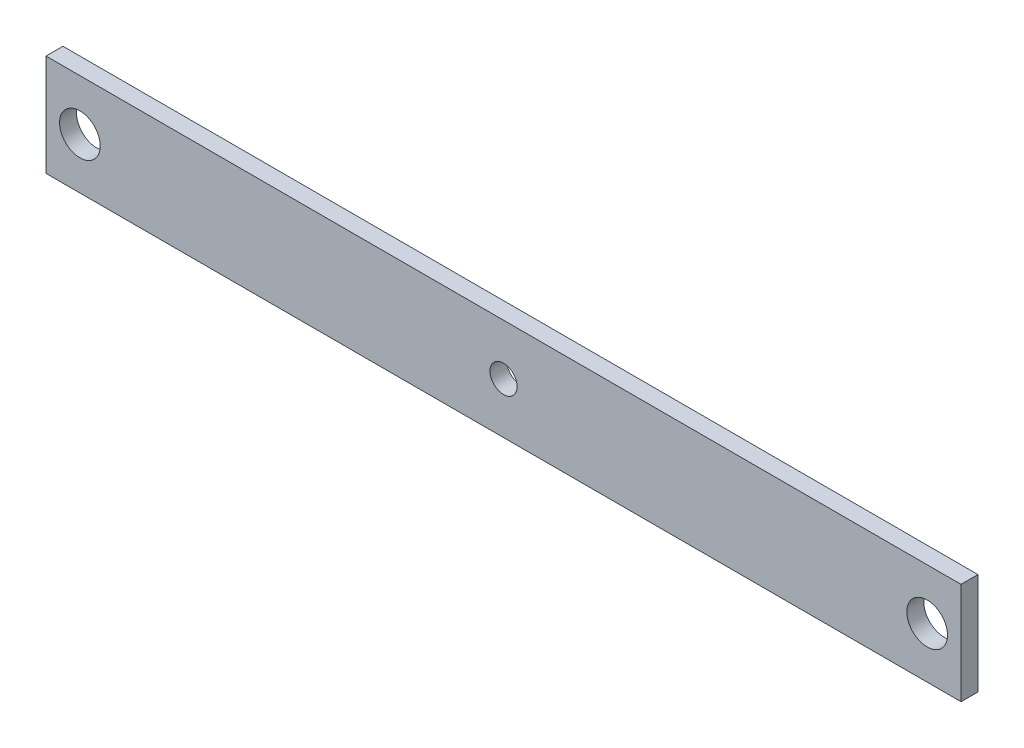
ISO-10303-21;
HEADER;
FILE_DESCRIPTION(('STEP AP214'),'2;1');
FILE_NAME('part.step','',(''),(''),'','','');
FILE_SCHEMA(('AUTOMOTIVE_DESIGN { 1 0 10303 214 1 1 1 1 }'));
ENDSEC;
DATA;
#1=APPLICATION_CONTEXT('core data for automotive mechanical design processes');
#2=APPLICATION_PROTOCOL_DEFINITION('international standard','automotive_design',2000,#1);
#3=PRODUCT_CONTEXT('',#1,'mechanical');
#4=PRODUCT('Part','Part','',(#3));
#5=PRODUCT_RELATED_PRODUCT_CATEGORY('part','',(#4));
#6=PRODUCT_DEFINITION_FORMATION('','',#4);
#7=PRODUCT_DEFINITION_CONTEXT('part definition',#1,'design');
#8=PRODUCT_DEFINITION('design','',#6,#7);
#9=PRODUCT_DEFINITION_SHAPE('','',#8);
#10=(LENGTH_UNIT() NAMED_UNIT(*) SI_UNIT(.MILLI.,.METRE.));
#11=(NAMED_UNIT(*) PLANE_ANGLE_UNIT() SI_UNIT($,.RADIAN.));
#12=(NAMED_UNIT(*) SI_UNIT($,.STERADIAN.) SOLID_ANGLE_UNIT());
#13=UNCERTAINTY_MEASURE_WITH_UNIT(LENGTH_MEASURE(1.E-05),#10,'distance_accuracy_value','');
#14=(GEOMETRIC_REPRESENTATION_CONTEXT(3) GLOBAL_UNCERTAINTY_ASSIGNED_CONTEXT((#13)) GLOBAL_UNIT_ASSIGNED_CONTEXT((#10,
#11,#12)) REPRESENTATION_CONTEXT('',''));
#15=CARTESIAN_POINT('',(0.,0.,0.));
#16=DIRECTION('',(0.,0.,1.));
#17=DIRECTION('',(1.,0.,0.));
#18=AXIS2_PLACEMENT_3D('',#15,#16,#17);
#19=CARTESIAN_POINT('',(0.,0.,5.));
#20=DIRECTION('',(0.,0.,1.));
#21=DIRECTION('',(1.,0.,0.));
#22=AXIS2_PLACEMENT_3D('',#19,#20,#21);
#23=PLANE('',#22);
#24=CARTESIAN_POINT('',(125.,0.,5.));
#25=DIRECTION('',(0.,0.,1.));
#26=DIRECTION('',(1.,0.,0.));
#27=AXIS2_PLACEMENT_3D('',#24,#25,#26);
#28=CIRCLE('',#27,6.00000000000002);
#29=CARTESIAN_POINT('',(131.,0.,5.));
#30=VERTEX_POINT('',#29);
#31=EDGE_CURVE('E117',#30,#30,#28,.T.);
#32=ORIENTED_EDGE('',*,*,#31,.F.);
#33=EDGE_LOOP('',(#32));
#34=FACE_BOUND('',#33,.T.);
#35=DIRECTION('',(0.,1.,0.));
#36=VECTOR('',#35,1.);
#37=CARTESIAN_POINT('',(135.,15.,5.));
#38=LINE('',#37,#36);
#39=CARTESIAN_POINT('',(135.,-15.,5.));
#40=VERTEX_POINT('',#39);
#41=CARTESIAN_POINT('',(135.,15.,5.));
#42=VERTEX_POINT('',#41);
#43=EDGE_CURVE('E87',#40,#42,#38,.T.);
#44=ORIENTED_EDGE('',*,*,#43,.T.);
#45=DIRECTION('',(-1.,0.,0.));
#46=VECTOR('',#45,1.);
#47=CARTESIAN_POINT('',(-135.,15.,5.));
#48=LINE('',#47,#46);
#49=CARTESIAN_POINT('',(-135.,15.,5.));
#50=VERTEX_POINT('',#49);
#51=EDGE_CURVE('E82',#42,#50,#48,.T.);
#52=ORIENTED_EDGE('',*,*,#51,.T.);
#53=DIRECTION('',(0.,-1.,0.));
#54=VECTOR('',#53,1.);
#55=CARTESIAN_POINT('',(-135.,15.,5.));
#56=LINE('',#55,#54);
#57=CARTESIAN_POINT('',(-135.,-15.,5.));
#58=VERTEX_POINT('',#57);
#59=EDGE_CURVE('E85',#50,#58,#56,.T.);
#60=ORIENTED_EDGE('',*,*,#59,.T.);
#61=DIRECTION('',(1.,0.,0.));
#62=VECTOR('',#61,1.);
#63=CARTESIAN_POINT('',(-135.,-15.,5.));
#64=LINE('',#63,#62);
#65=EDGE_CURVE('E52',#58,#40,#64,.T.);
#66=ORIENTED_EDGE('',*,*,#65,.T.);
#67=EDGE_LOOP('',(#44,#52,#60,#66));
#68=FACE_BOUND('',#67,.T.);
#69=CARTESIAN_POINT('',(-125.,0.,5.));
#70=DIRECTION('',(0.,0.,1.));
#71=DIRECTION('',(1.,0.,0.));
#72=AXIS2_PLACEMENT_3D('',#69,#70,#71);
#73=CIRCLE('',#72,6.);
#74=CARTESIAN_POINT('',(-119.,0.,5.));
#75=VERTEX_POINT('',#74);
#76=EDGE_CURVE('E102',#75,#75,#73,.T.);
#77=ORIENTED_EDGE('',*,*,#76,.F.);
#78=EDGE_LOOP('',(#77));
#79=FACE_BOUND('',#78,.T.);
#80=CARTESIAN_POINT('',(0.,0.,5.));
#81=DIRECTION('',(0.,0.,1.));
#82=DIRECTION('',(1.,0.,0.));
#83=AXIS2_PLACEMENT_3D('',#80,#81,#82);
#84=CIRCLE('',#83,4.);
#85=CARTESIAN_POINT('',(4.,0.,5.));
#86=VERTEX_POINT('',#85);
#87=EDGE_CURVE('E123',#86,#86,#84,.T.);
#88=ORIENTED_EDGE('',*,*,#87,.F.);
#89=EDGE_LOOP('',(#88));
#90=FACE_BOUND('',#89,.T.);
#91=ADVANCED_FACE('F35',(#34,#68,#79,#90),#23,.T.);
#92=CARTESIAN_POINT('',(0.,0.,0.));
#93=DIRECTION('',(0.,0.,1.));
#94=DIRECTION('',(1.,0.,0.));
#95=AXIS2_PLACEMENT_3D('',#92,#93,#94);
#96=PLANE('',#95);
#97=DIRECTION('',(0.,1.,0.));
#98=VECTOR('',#97,1.);
#99=CARTESIAN_POINT('',(135.,15.,0.));
#100=LINE('',#99,#98);
#101=CARTESIAN_POINT('',(135.,-15.,0.));
#102=VERTEX_POINT('',#101);
#103=CARTESIAN_POINT('',(135.,15.,0.));
#104=VERTEX_POINT('',#103);
#105=EDGE_CURVE('E99',#102,#104,#100,.T.);
#106=ORIENTED_EDGE('',*,*,#105,.F.);
#107=DIRECTION('',(1.,0.,0.));
#108=VECTOR('',#107,1.);
#109=CARTESIAN_POINT('',(-135.,-15.,0.));
#110=LINE('',#109,#108);
#111=CARTESIAN_POINT('',(-135.,-15.,0.));
#112=VERTEX_POINT('',#111);
#113=EDGE_CURVE('E75',#112,#102,#110,.T.);
#114=ORIENTED_EDGE('',*,*,#113,.F.);
#115=DIRECTION('',(0.,-1.,0.));
#116=VECTOR('',#115,1.);
#117=CARTESIAN_POINT('',(-135.,15.,0.));
#118=LINE('',#117,#116);
#119=CARTESIAN_POINT('',(-135.,15.,0.));
#120=VERTEX_POINT('',#119);
#121=EDGE_CURVE('E69',#120,#112,#118,.T.);
#122=ORIENTED_EDGE('',*,*,#121,.F.);
#123=DIRECTION('',(-1.,0.,0.));
#124=VECTOR('',#123,1.);
#125=CARTESIAN_POINT('',(-135.,15.,0.));
#126=LINE('',#125,#124);
#127=EDGE_CURVE('E91',#104,#120,#126,.T.);
#128=ORIENTED_EDGE('',*,*,#127,.F.);
#129=EDGE_LOOP('',(#106,#114,#122,#128));
#130=FACE_BOUND('',#129,.T.);
#131=CARTESIAN_POINT('',(-125.,0.,0.));
#132=DIRECTION('',(0.,0.,1.));
#133=DIRECTION('',(1.,0.,0.));
#134=AXIS2_PLACEMENT_3D('',#131,#132,#133);
#135=CIRCLE('',#134,6.);
#136=CARTESIAN_POINT('',(-119.,0.,0.));
#137=VERTEX_POINT('',#136);
#138=EDGE_CURVE('E114',#137,#137,#135,.T.);
#139=ORIENTED_EDGE('',*,*,#138,.T.);
#140=EDGE_LOOP('',(#139));
#141=FACE_BOUND('',#140,.T.);
#142=CARTESIAN_POINT('',(125.,0.,0.));
#143=DIRECTION('',(0.,0.,1.));
#144=DIRECTION('',(1.,0.,0.));
#145=AXIS2_PLACEMENT_3D('',#142,#143,#144);
#146=CIRCLE('',#145,6.00000000000002);
#147=CARTESIAN_POINT('',(131.,0.,0.));
#148=VERTEX_POINT('',#147);
#149=EDGE_CURVE('E120',#148,#148,#146,.T.);
#150=ORIENTED_EDGE('',*,*,#149,.T.);
#151=EDGE_LOOP('',(#150));
#152=FACE_BOUND('',#151,.T.);
#153=CARTESIAN_POINT('',(0.,0.,0.));
#154=DIRECTION('',(0.,0.,1.));
#155=DIRECTION('',(1.,0.,0.));
#156=AXIS2_PLACEMENT_3D('',#153,#154,#155);
#157=CIRCLE('',#156,4.);
#158=CARTESIAN_POINT('',(4.,0.,0.));
#159=VERTEX_POINT('',#158);
#160=EDGE_CURVE('E126',#159,#159,#157,.T.);
#161=ORIENTED_EDGE('',*,*,#160,.T.);
#162=EDGE_LOOP('',(#161));
#163=FACE_BOUND('',#162,.T.);
#164=ADVANCED_FACE('F110',(#130,#141,#152,#163),#96,.F.);
#165=CARTESIAN_POINT('',(135.,15.,5.));
#166=DIRECTION('',(-1.,0.,0.));
#167=DIRECTION('',(0.,0.,1.));
#168=AXIS2_PLACEMENT_3D('',#165,#166,#167);
#169=PLANE('',#168);
#170=ORIENTED_EDGE('',*,*,#105,.T.);
#171=DIRECTION('',(0.,0.,-1.));
#172=VECTOR('',#171,1.);
#173=CARTESIAN_POINT('',(135.,15.,5.));
#174=LINE('',#173,#172);
#175=EDGE_CURVE('E11',#42,#104,#174,.T.);
#176=ORIENTED_EDGE('',*,*,#175,.F.);
#177=ORIENTED_EDGE('',*,*,#43,.F.);
#178=DIRECTION('',(0.,0.,-1.));
#179=VECTOR('',#178,1.);
#180=CARTESIAN_POINT('',(135.,-15.,5.));
#181=LINE('',#180,#179);
#182=EDGE_CURVE('E95',#40,#102,#181,.T.);
#183=ORIENTED_EDGE('',*,*,#182,.T.);
#184=EDGE_LOOP('',(#170,#176,#177,#183));
#185=FACE_BOUND('',#184,.T.);
#186=ADVANCED_FACE('F37',(#185),#169,.F.);
#187=CARTESIAN_POINT('',(-135.,15.,5.));
#188=DIRECTION('',(0.,-1.,0.));
#189=DIRECTION('',(0.,0.,-1.));
#190=AXIS2_PLACEMENT_3D('',#187,#188,#189);
#191=PLANE('',#190);
#192=ORIENTED_EDGE('',*,*,#127,.T.);
#193=DIRECTION('',(0.,0.,-1.));
#194=VECTOR('',#193,1.);
#195=CARTESIAN_POINT('',(-135.,15.,5.));
#196=LINE('',#195,#194);
#197=EDGE_CURVE('E44',#50,#120,#196,.T.);
#198=ORIENTED_EDGE('',*,*,#197,.F.);
#199=ORIENTED_EDGE('',*,*,#51,.F.);
#200=ORIENTED_EDGE('',*,*,#175,.T.);
#201=EDGE_LOOP('',(#192,#198,#199,#200));
#202=FACE_BOUND('',#201,.T.);
#203=ADVANCED_FACE('F90',(#202),#191,.F.);
#204=CARTESIAN_POINT('',(-135.,15.,5.));
#205=DIRECTION('',(1.,0.,0.));
#206=DIRECTION('',(0.,0.,-1.));
#207=AXIS2_PLACEMENT_3D('',#204,#205,#206);
#208=PLANE('',#207);
#209=ORIENTED_EDGE('',*,*,#121,.T.);
#210=DIRECTION('',(0.,0.,-1.));
#211=VECTOR('',#210,1.);
#212=CARTESIAN_POINT('',(-135.,-15.,5.));
#213=LINE('',#212,#211);
#214=EDGE_CURVE('E92',#58,#112,#213,.T.);
#215=ORIENTED_EDGE('',*,*,#214,.F.);
#216=ORIENTED_EDGE('',*,*,#59,.F.);
#217=ORIENTED_EDGE('',*,*,#197,.T.);
#218=EDGE_LOOP('',(#209,#215,#216,#217));
#219=FACE_BOUND('',#218,.T.);
#220=ADVANCED_FACE('F93',(#219),#208,.F.);
#221=CARTESIAN_POINT('',(-135.,-15.,5.));
#222=DIRECTION('',(0.,1.,0.));
#223=DIRECTION('',(0.,0.,1.));
#224=AXIS2_PLACEMENT_3D('',#221,#222,#223);
#225=PLANE('',#224);
#226=ORIENTED_EDGE('',*,*,#113,.T.);
#227=ORIENTED_EDGE('',*,*,#182,.F.);
#228=ORIENTED_EDGE('',*,*,#65,.F.);
#229=ORIENTED_EDGE('',*,*,#214,.T.);
#230=EDGE_LOOP('',(#226,#227,#228,#229));
#231=FACE_BOUND('',#230,.T.);
#232=ADVANCED_FACE('F107',(#231),#225,.F.);
#233=CARTESIAN_POINT('',(-125.,0.,5.));
#234=DIRECTION('',(0.,0.,-1.));
#235=DIRECTION('',(-1.,0.,0.));
#236=AXIS2_PLACEMENT_3D('',#233,#234,#235);
#237=CYLINDRICAL_SURFACE('',#236,6.);
#238=ORIENTED_EDGE('',*,*,#76,.T.);
#239=EDGE_LOOP('',(#238));
#240=FACE_BOUND('',#239,.T.);
#241=ORIENTED_EDGE('',*,*,#138,.F.);
#242=EDGE_LOOP('',(#241));
#243=FACE_BOUND('',#242,.T.);
#244=ADVANCED_FACE('F144',(#240,#243),#237,.F.);
#245=CARTESIAN_POINT('',(125.,0.,5.));
#246=DIRECTION('',(0.,0.,-1.));
#247=DIRECTION('',(-1.,0.,0.));
#248=AXIS2_PLACEMENT_3D('',#245,#246,#247);
#249=CYLINDRICAL_SURFACE('',#248,6.00000000000002);
#250=ORIENTED_EDGE('',*,*,#31,.T.);
#251=EDGE_LOOP('',(#250));
#252=FACE_BOUND('',#251,.T.);
#253=ORIENTED_EDGE('',*,*,#149,.F.);
#254=EDGE_LOOP('',(#253));
#255=FACE_BOUND('',#254,.T.);
#256=ADVANCED_FACE('F190',(#252,#255),#249,.F.);
#257=CARTESIAN_POINT('',(0.,0.,5.));
#258=DIRECTION('',(0.,0.,-1.));
#259=DIRECTION('',(-1.,0.,0.));
#260=AXIS2_PLACEMENT_3D('',#257,#258,#259);
#261=CYLINDRICAL_SURFACE('',#260,4.);
#262=ORIENTED_EDGE('',*,*,#87,.T.);
#263=EDGE_LOOP('',(#262));
#264=FACE_BOUND('',#263,.T.);
#265=ORIENTED_EDGE('',*,*,#160,.F.);
#266=EDGE_LOOP('',(#265));
#267=FACE_BOUND('',#266,.T.);
#268=ADVANCED_FACE('F132',(#264,#267),#261,.F.);
#269=CLOSED_SHELL('',(#91,#164,#186,#203,#220,#232,#244,#256,#268));
#270=MANIFOLD_SOLID_BREP('B2',#269);
#271=ADVANCED_BREP_SHAPE_REPRESENTATION('',(#18,#270),#14);
#272=SHAPE_DEFINITION_REPRESENTATION(#9,#271);
ENDSEC;
END-ISO-10303-21;
